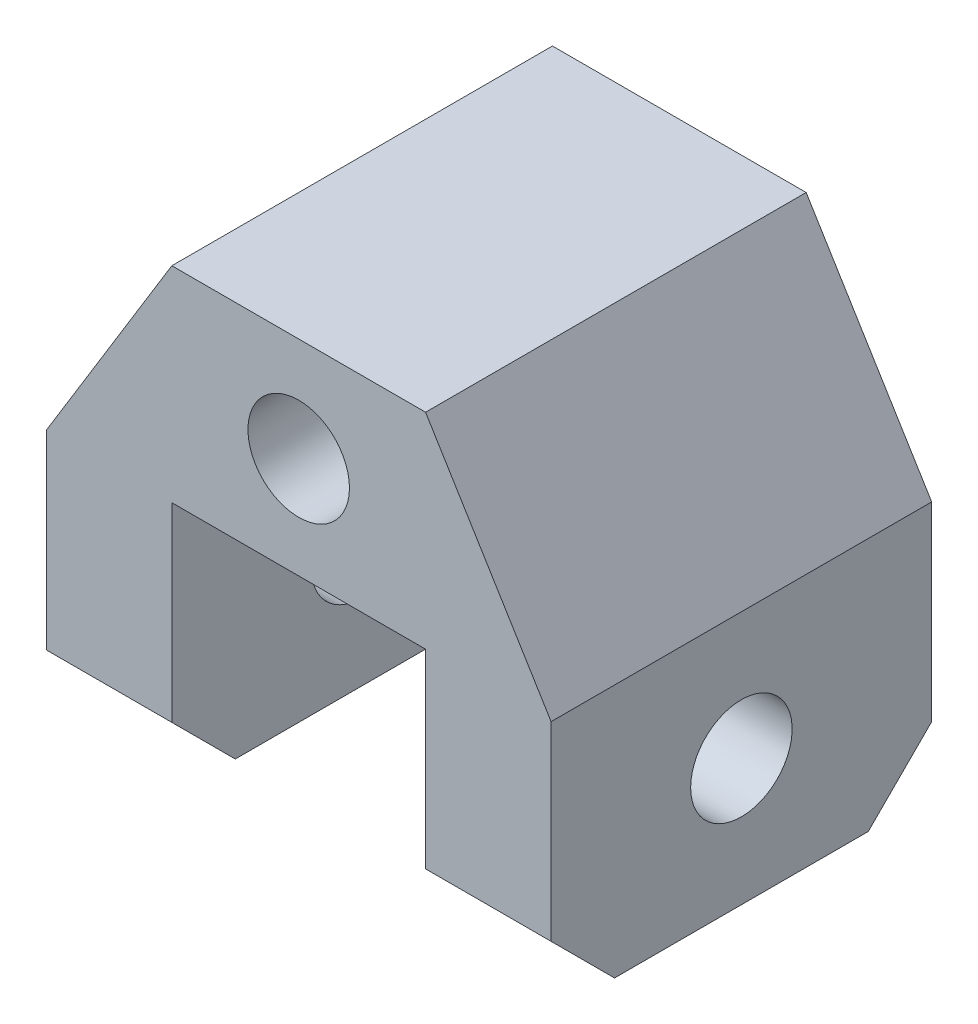
ISO-10303-21;
HEADER;
FILE_DESCRIPTION(('STEP AP214'),'2;1');
FILE_NAME('part.step','',(''),(''),'','','');
FILE_SCHEMA(('AUTOMOTIVE_DESIGN { 1 0 10303 214 1 1 1 1 }'));
ENDSEC;
DATA;
#1=APPLICATION_CONTEXT('core data for automotive mechanical design processes');
#2=APPLICATION_PROTOCOL_DEFINITION('international standard','automotive_design',2000,#1);
#3=PRODUCT_CONTEXT('',#1,'mechanical');
#4=PRODUCT('Part','Part','',(#3));
#5=PRODUCT_RELATED_PRODUCT_CATEGORY('part','',(#4));
#6=PRODUCT_DEFINITION_FORMATION('','',#4);
#7=PRODUCT_DEFINITION_CONTEXT('part definition',#1,'design');
#8=PRODUCT_DEFINITION('design','',#6,#7);
#9=PRODUCT_DEFINITION_SHAPE('','',#8);
#10=(LENGTH_UNIT() NAMED_UNIT(*) SI_UNIT(.MILLI.,.METRE.));
#11=(NAMED_UNIT(*) PLANE_ANGLE_UNIT() SI_UNIT($,.RADIAN.));
#12=(NAMED_UNIT(*) SI_UNIT($,.STERADIAN.) SOLID_ANGLE_UNIT());
#13=UNCERTAINTY_MEASURE_WITH_UNIT(LENGTH_MEASURE(1.E-05),#10,'distance_accuracy_value','');
#14=(GEOMETRIC_REPRESENTATION_CONTEXT(3) GLOBAL_UNCERTAINTY_ASSIGNED_CONTEXT((#13)) GLOBAL_UNIT_ASSIGNED_CONTEXT((#10,
#11,#12)) REPRESENTATION_CONTEXT('',''));
#15=CARTESIAN_POINT('',(0.,0.,0.));
#16=DIRECTION('',(0.,0.,1.));
#17=DIRECTION('',(1.,0.,0.));
#18=AXIS2_PLACEMENT_3D('',#15,#16,#17);
#19=CARTESIAN_POINT('',(35.,-28.2784738041002,30.));
#20=DIRECTION('',(0.,1.,0.));
#21=DIRECTION('',(0.,0.,1.));
#22=AXIS2_PLACEMENT_3D('',#19,#20,#21);
#23=PLANE('',#22);
#24=DIRECTION('',(0.,0.,-1.));
#25=VECTOR('',#24,1.);
#26=CARTESIAN_POINT('',(35.,-28.2784738041002,30.));
#27=LINE('',#26,#25);
#28=CARTESIAN_POINT('',(35.,-28.2784738041002,25.));
#29=VERTEX_POINT('',#28);
#30=CARTESIAN_POINT('',(35.,-28.2784738041002,5.));
#31=VERTEX_POINT('',#30);
#32=EDGE_CURVE('E173',#29,#31,#27,.T.);
#33=ORIENTED_EDGE('',*,*,#32,.T.);
#34=DIRECTION('',(1.,0.,0.));
#35=VECTOR('',#34,1.);
#36=CARTESIAN_POINT('',(44.8943898447674,-28.2784738041002,4.99999999999999));
#37=LINE('',#36,#35);
#38=CARTESIAN_POINT('',(44.8943898447674,-28.2784738041002,5.));
#39=VERTEX_POINT('',#38);
#40=EDGE_CURVE('E232',#31,#39,#37,.T.);
#41=ORIENTED_EDGE('',*,*,#40,.T.);
#42=DIRECTION('',(0.,0.,-1.));
#43=VECTOR('',#42,1.);
#44=CARTESIAN_POINT('',(44.8943898447674,-28.2784738041002,30.));
#45=LINE('',#44,#43);
#46=CARTESIAN_POINT('',(44.8943898447674,-28.2784738041002,25.));
#47=VERTEX_POINT('',#46);
#48=EDGE_CURVE('E151',#47,#39,#45,.T.);
#49=ORIENTED_EDGE('',*,*,#48,.F.);
#50=DIRECTION('',(-1.,0.,0.));
#51=VECTOR('',#50,1.);
#52=CARTESIAN_POINT('',(35.,-28.2784738041002,25.));
#53=LINE('',#52,#51);
#54=EDGE_CURVE('E230',#47,#29,#53,.T.);
#55=ORIENTED_EDGE('',*,*,#54,.T.);
#56=EDGE_LOOP('',(#33,#41,#49,#55));
#57=FACE_BOUND('',#56,.T.);
#58=ADVANCED_FACE('F31',(#57),#23,.F.);
#59=CARTESIAN_POINT('',(44.8943898447674,-8.27847380410023,30.));
#60=DIRECTION('',(-1.,0.,0.));
#61=DIRECTION('',(0.,0.,1.));
#62=AXIS2_PLACEMENT_3D('',#59,#60,#61);
#63=PLANE('',#62);
#64=CARTESIAN_POINT('',(44.8943898447674,-18.2784738041002,15.));
#65=DIRECTION('',(-1.,0.,0.));
#66=DIRECTION('',(0.,0.,1.));
#67=AXIS2_PLACEMENT_3D('',#64,#65,#66);
#68=CIRCLE('',#67,4.);
#69=CARTESIAN_POINT('',(44.8943898447674,-18.2784738041002,19.));
#70=VERTEX_POINT('',#69);
#71=EDGE_CURVE('E350',#70,#70,#68,.T.);
#72=ORIENTED_EDGE('',*,*,#71,.T.);
#73=EDGE_LOOP('',(#72));
#74=FACE_BOUND('',#73,.T.);
#75=ORIENTED_EDGE('',*,*,#48,.T.);
#76=DIRECTION('',(0.,0.707106781186549,-0.707106781186547));
#77=VECTOR('',#76,1.);
#78=CARTESIAN_POINT('',(44.8943898447674,-28.2784738041002,4.99999999999999));
#79=LINE('',#78,#77);
#80=CARTESIAN_POINT('',(44.8943898447674,-23.2784738041002,0.));
#81=VERTEX_POINT('',#80);
#82=EDGE_CURVE('E236',#39,#81,#79,.T.);
#83=ORIENTED_EDGE('',*,*,#82,.T.);
#84=DIRECTION('',(0.,1.,0.));
#85=VECTOR('',#84,1.);
#86=CARTESIAN_POINT('',(44.8943898447674,-8.27847380410023,0.));
#87=LINE('',#86,#85);
#88=CARTESIAN_POINT('',(44.8943898447674,-8.27847380410023,0.));
#89=VERTEX_POINT('',#88);
#90=EDGE_CURVE('E148',#81,#89,#87,.T.);
#91=ORIENTED_EDGE('',*,*,#90,.T.);
#92=DIRECTION('',(0.,0.,-1.));
#93=VECTOR('',#92,1.);
#94=CARTESIAN_POINT('',(44.8943898447674,-8.27847380410023,30.));
#95=LINE('',#94,#93);
#96=CARTESIAN_POINT('',(44.8943898447674,-8.27847380410023,30.));
#97=VERTEX_POINT('',#96);
#98=EDGE_CURVE('E144',#97,#89,#95,.T.);
#99=ORIENTED_EDGE('',*,*,#98,.F.);
#100=DIRECTION('',(0.,1.,0.));
#101=VECTOR('',#100,1.);
#102=CARTESIAN_POINT('',(44.8943898447674,-8.27847380410023,30.));
#103=LINE('',#102,#101);
#104=CARTESIAN_POINT('',(44.8943898447674,-23.2784738041002,30.));
#105=VERTEX_POINT('',#104);
#106=EDGE_CURVE('E134',#105,#97,#103,.T.);
#107=ORIENTED_EDGE('',*,*,#106,.F.);
#108=DIRECTION('',(0.,0.707106781186547,0.707106781186549));
#109=VECTOR('',#108,1.);
#110=CARTESIAN_POINT('',(44.8943898447674,-23.2784738041002,30.));
#111=LINE('',#110,#109);
#112=EDGE_CURVE('E55',#105,#47,#111,.F.);
#113=ORIENTED_EDGE('',*,*,#112,.T.);
#114=EDGE_LOOP('',(#75,#83,#91,#99,#107,#113));
#115=FACE_BOUND('',#114,.T.);
#116=ADVANCED_FACE('F146',(#74,#115),#63,.F.);
#117=CARTESIAN_POINT('',(35.,7.89639583302583,30.));
#118=DIRECTION('',(-0.853053020974568,-0.521824245705548,0.));
#119=DIRECTION('',(0.521824245705548,-0.853053020974568,0.));
#120=AXIS2_PLACEMENT_3D('',#117,#118,#119);
#121=PLANE('',#120);
#122=DIRECTION('',(-0.521824245705548,0.853053020974567,0.));
#123=VECTOR('',#122,1.);
#124=CARTESIAN_POINT('',(35.,7.89639583302583,0.));
#125=LINE('',#124,#123);
#126=CARTESIAN_POINT('',(35.,7.89639583302583,0.));
#127=VERTEX_POINT('',#126);
#128=EDGE_CURVE('E175',#89,#127,#125,.T.);
#129=ORIENTED_EDGE('',*,*,#128,.T.);
#130=DIRECTION('',(0.,0.,-1.));
#131=VECTOR('',#130,1.);
#132=CARTESIAN_POINT('',(35.,7.89639583302583,30.));
#133=LINE('',#132,#131);
#134=CARTESIAN_POINT('',(35.,7.89639583302583,30.));
#135=VERTEX_POINT('',#134);
#136=EDGE_CURVE('E152',#135,#127,#133,.T.);
#137=ORIENTED_EDGE('',*,*,#136,.F.);
#138=DIRECTION('',(-0.521824245705548,0.853053020974567,0.));
#139=VECTOR('',#138,1.);
#140=CARTESIAN_POINT('',(35.,7.89639583302583,30.));
#141=LINE('',#140,#139);
#142=EDGE_CURVE('E138',#97,#135,#141,.T.);
#143=ORIENTED_EDGE('',*,*,#142,.F.);
#144=ORIENTED_EDGE('',*,*,#98,.T.);
#145=EDGE_LOOP('',(#129,#137,#143,#144));
#146=FACE_BOUND('',#145,.T.);
#147=ADVANCED_FACE('F154',(#146),#121,.F.);
#148=CARTESIAN_POINT('',(15.,7.89639583302583,30.));
#149=DIRECTION('',(0.,-1.,0.));
#150=DIRECTION('',(0.,0.,-1.));
#151=AXIS2_PLACEMENT_3D('',#148,#149,#150);
#152=PLANE('',#151);
#153=DIRECTION('',(-1.,0.,0.));
#154=VECTOR('',#153,1.);
#155=CARTESIAN_POINT('',(15.,7.89639583302583,0.));
#156=LINE('',#155,#154);
#157=CARTESIAN_POINT('',(15.,7.89639583302583,0.));
#158=VERTEX_POINT('',#157);
#159=EDGE_CURVE('E178',#127,#158,#156,.T.);
#160=ORIENTED_EDGE('',*,*,#159,.T.);
#161=DIRECTION('',(0.,0.,-1.));
#162=VECTOR('',#161,1.);
#163=CARTESIAN_POINT('',(15.,7.89639583302583,30.));
#164=LINE('',#163,#162);
#165=CARTESIAN_POINT('',(15.,7.89639583302583,30.));
#166=VERTEX_POINT('',#165);
#167=EDGE_CURVE('E208',#166,#158,#164,.T.);
#168=ORIENTED_EDGE('',*,*,#167,.F.);
#169=DIRECTION('',(-1.,0.,0.));
#170=VECTOR('',#169,1.);
#171=CARTESIAN_POINT('',(15.,7.89639583302583,30.));
#172=LINE('',#171,#170);
#173=EDGE_CURVE('E157',#135,#166,#172,.T.);
#174=ORIENTED_EDGE('',*,*,#173,.F.);
#175=ORIENTED_EDGE('',*,*,#136,.T.);
#176=EDGE_LOOP('',(#160,#168,#174,#175));
#177=FACE_BOUND('',#176,.T.);
#178=ADVANCED_FACE('F272',(#177),#152,.F.);
#179=CARTESIAN_POINT('',(15.,7.89639583302583,30.));
#180=DIRECTION('',(0.853053020974567,-0.521824245705548,0.));
#181=DIRECTION('',(0.521824245705548,0.853053020974567,0.));
#182=AXIS2_PLACEMENT_3D('',#179,#180,#181);
#183=PLANE('',#182);
#184=DIRECTION('',(-0.521824245705548,-0.853053020974567,0.));
#185=VECTOR('',#184,1.);
#186=CARTESIAN_POINT('',(15.,7.89639583302583,0.));
#187=LINE('',#186,#185);
#188=CARTESIAN_POINT('',(5.10561015523264,-8.27847380410023,0.));
#189=VERTEX_POINT('',#188);
#190=EDGE_CURVE('E180',#158,#189,#187,.T.);
#191=ORIENTED_EDGE('',*,*,#190,.T.);
#192=DIRECTION('',(0.,0.,-1.));
#193=VECTOR('',#192,1.);
#194=CARTESIAN_POINT('',(5.10561015523264,-8.27847380410023,30.));
#195=LINE('',#194,#193);
#196=CARTESIAN_POINT('',(5.10561015523264,-8.27847380410023,30.));
#197=VERTEX_POINT('',#196);
#198=EDGE_CURVE('E205',#197,#189,#195,.T.);
#199=ORIENTED_EDGE('',*,*,#198,.F.);
#200=DIRECTION('',(-0.521824245705548,-0.853053020974567,0.));
#201=VECTOR('',#200,1.);
#202=CARTESIAN_POINT('',(15.,7.89639583302583,30.));
#203=LINE('',#202,#201);
#204=EDGE_CURVE('E159',#166,#197,#203,.T.);
#205=ORIENTED_EDGE('',*,*,#204,.F.);
#206=ORIENTED_EDGE('',*,*,#167,.T.);
#207=EDGE_LOOP('',(#191,#199,#205,#206));
#208=FACE_BOUND('',#207,.T.);
#209=ADVANCED_FACE('F277',(#208),#183,.F.);
#210=CARTESIAN_POINT('',(5.10561015523264,-8.27847380410023,30.));
#211=DIRECTION('',(1.,0.,0.));
#212=DIRECTION('',(0.,1.,0.));
#213=AXIS2_PLACEMENT_3D('',#210,#211,#212);
#214=PLANE('',#213);
#215=CARTESIAN_POINT('',(5.10561015523264,-18.2784738041002,15.));
#216=DIRECTION('',(-1.,0.,0.));
#217=DIRECTION('',(0.,0.,1.));
#218=AXIS2_PLACEMENT_3D('',#215,#216,#217);
#219=CIRCLE('',#218,4.);
#220=CARTESIAN_POINT('',(5.10561015523264,-18.2784738041002,19.));
#221=VERTEX_POINT('',#220);
#222=EDGE_CURVE('E347',#221,#221,#219,.T.);
#223=ORIENTED_EDGE('',*,*,#222,.F.);
#224=EDGE_LOOP('',(#223));
#225=FACE_BOUND('',#224,.T.);
#226=DIRECTION('',(0.,-1.,0.));
#227=VECTOR('',#226,1.);
#228=CARTESIAN_POINT('',(5.10561015523264,-8.27847380410023,0.));
#229=LINE('',#228,#227);
#230=CARTESIAN_POINT('',(5.10561015523264,-23.2784738041002,0.));
#231=VERTEX_POINT('',#230);
#232=EDGE_CURVE('E182',#189,#231,#229,.T.);
#233=ORIENTED_EDGE('',*,*,#232,.T.);
#234=DIRECTION('',(0.,-0.707106781186549,0.707106781186547));
#235=VECTOR('',#234,1.);
#236=CARTESIAN_POINT('',(5.10561015523264,-28.2784738041002,4.99999999999999));
#237=LINE('',#236,#235);
#238=CARTESIAN_POINT('',(5.10561015523264,-28.2784738041002,5.));
#239=VERTEX_POINT('',#238);
#240=EDGE_CURVE('E228',#231,#239,#237,.T.);
#241=ORIENTED_EDGE('',*,*,#240,.T.);
#242=DIRECTION('',(0.,0.,-1.));
#243=VECTOR('',#242,1.);
#244=CARTESIAN_POINT('',(5.10561015523264,-28.2784738041002,30.));
#245=LINE('',#244,#243);
#246=CARTESIAN_POINT('',(5.10561015523264,-28.2784738041002,25.));
#247=VERTEX_POINT('',#246);
#248=EDGE_CURVE('E202',#247,#239,#245,.T.);
#249=ORIENTED_EDGE('',*,*,#248,.F.);
#250=DIRECTION('',(0.,-0.707106781186547,-0.707106781186549));
#251=VECTOR('',#250,1.);
#252=CARTESIAN_POINT('',(5.10561015523264,-23.2784738041002,30.));
#253=LINE('',#252,#251);
#254=CARTESIAN_POINT('',(5.10561015523264,-23.2784738041002,30.));
#255=VERTEX_POINT('',#254);
#256=EDGE_CURVE('E226',#247,#255,#253,.F.);
#257=ORIENTED_EDGE('',*,*,#256,.T.);
#258=DIRECTION('',(0.,-1.,0.));
#259=VECTOR('',#258,1.);
#260=CARTESIAN_POINT('',(5.10561015523264,-8.27847380410023,30.));
#261=LINE('',#260,#259);
#262=EDGE_CURVE('E164',#197,#255,#261,.T.);
#263=ORIENTED_EDGE('',*,*,#262,.F.);
#264=ORIENTED_EDGE('',*,*,#198,.T.);
#265=EDGE_LOOP('',(#233,#241,#249,#257,#263,#264));
#266=FACE_BOUND('',#265,.T.);
#267=ADVANCED_FACE('F280',(#225,#266),#214,.F.);
#268=CARTESIAN_POINT('',(5.10561015523264,-28.2784738041002,30.));
#269=DIRECTION('',(0.,1.,0.));
#270=DIRECTION('',(0.,0.,1.));
#271=AXIS2_PLACEMENT_3D('',#268,#269,#270);
#272=PLANE('',#271);
#273=ORIENTED_EDGE('',*,*,#248,.T.);
#274=DIRECTION('',(1.,0.,0.));
#275=VECTOR('',#274,1.);
#276=CARTESIAN_POINT('',(15.,-28.2784738041002,4.99999999999999));
#277=LINE('',#276,#275);
#278=CARTESIAN_POINT('',(15.,-28.2784738041002,5.));
#279=VERTEX_POINT('',#278);
#280=EDGE_CURVE('E215',#239,#279,#277,.T.);
#281=ORIENTED_EDGE('',*,*,#280,.T.);
#282=DIRECTION('',(0.,0.,-1.));
#283=VECTOR('',#282,1.);
#284=CARTESIAN_POINT('',(15.,-28.2784738041002,30.));
#285=LINE('',#284,#283);
#286=CARTESIAN_POINT('',(15.,-28.2784738041002,25.));
#287=VERTEX_POINT('',#286);
#288=EDGE_CURVE('E199',#287,#279,#285,.T.);
#289=ORIENTED_EDGE('',*,*,#288,.F.);
#290=DIRECTION('',(-1.,0.,0.));
#291=VECTOR('',#290,1.);
#292=CARTESIAN_POINT('',(5.10561015523264,-28.2784738041002,25.));
#293=LINE('',#292,#291);
#294=EDGE_CURVE('E213',#287,#247,#293,.T.);
#295=ORIENTED_EDGE('',*,*,#294,.T.);
#296=EDGE_LOOP('',(#273,#281,#289,#295));
#297=FACE_BOUND('',#296,.T.);
#298=ADVANCED_FACE('F284',(#297),#272,.F.);
#299=CARTESIAN_POINT('',(15.,-28.2784738041002,30.));
#300=DIRECTION('',(-1.,0.,0.));
#301=DIRECTION('',(0.,0.,1.));
#302=AXIS2_PLACEMENT_3D('',#299,#300,#301);
#303=PLANE('',#302);
#304=CARTESIAN_POINT('',(15.,-18.2784738041002,15.));
#305=DIRECTION('',(-1.,0.,0.));
#306=DIRECTION('',(0.,0.,1.));
#307=AXIS2_PLACEMENT_3D('',#304,#305,#306);
#308=CIRCLE('',#307,4.);
#309=CARTESIAN_POINT('',(15.,-18.2784738041002,19.));
#310=VERTEX_POINT('',#309);
#311=EDGE_CURVE('E176',#310,#310,#308,.T.);
#312=ORIENTED_EDGE('',*,*,#311,.T.);
#313=EDGE_LOOP('',(#312));
#314=FACE_BOUND('',#313,.T.);
#315=ORIENTED_EDGE('',*,*,#288,.T.);
#316=DIRECTION('',(0.,0.707106781186549,-0.707106781186547));
#317=VECTOR('',#316,1.);
#318=CARTESIAN_POINT('',(15.,-28.2784738041002,4.99999999999999));
#319=LINE('',#318,#317);
#320=CARTESIAN_POINT('',(15.,-23.2784738041002,0.));
#321=VERTEX_POINT('',#320);
#322=EDGE_CURVE('E220',#279,#321,#319,.T.);
#323=ORIENTED_EDGE('',*,*,#322,.T.);
#324=DIRECTION('',(0.,1.,0.));
#325=VECTOR('',#324,1.);
#326=CARTESIAN_POINT('',(15.,-28.2784738041002,0.));
#327=LINE('',#326,#325);
#328=CARTESIAN_POINT('',(15.,-8.27847380410023,0.));
#329=VERTEX_POINT('',#328);
#330=EDGE_CURVE('E185',#321,#329,#327,.T.);
#331=ORIENTED_EDGE('',*,*,#330,.T.);
#332=DIRECTION('',(0.,0.,-1.));
#333=VECTOR('',#332,1.);
#334=CARTESIAN_POINT('',(15.,-8.27847380410023,30.));
#335=LINE('',#334,#333);
#336=CARTESIAN_POINT('',(15.,-8.27847380410023,30.));
#337=VERTEX_POINT('',#336);
#338=EDGE_CURVE('E196',#337,#329,#335,.T.);
#339=ORIENTED_EDGE('',*,*,#338,.F.);
#340=DIRECTION('',(0.,1.,0.));
#341=VECTOR('',#340,1.);
#342=CARTESIAN_POINT('',(15.,-28.2784738041002,30.));
#343=LINE('',#342,#341);
#344=CARTESIAN_POINT('',(15.,-23.2784738041002,30.));
#345=VERTEX_POINT('',#344);
#346=EDGE_CURVE('E167',#345,#337,#343,.T.);
#347=ORIENTED_EDGE('',*,*,#346,.F.);
#348=DIRECTION('',(0.,0.707106781186547,0.707106781186549));
#349=VECTOR('',#348,1.);
#350=CARTESIAN_POINT('',(15.,-23.2784738041002,30.));
#351=LINE('',#350,#349);
#352=EDGE_CURVE('E218',#345,#287,#351,.F.);
#353=ORIENTED_EDGE('',*,*,#352,.T.);
#354=EDGE_LOOP('',(#315,#323,#331,#339,#347,#353));
#355=FACE_BOUND('',#354,.T.);
#356=ADVANCED_FACE('F249',(#314,#355),#303,.F.);
#357=CARTESIAN_POINT('',(15.,-8.27847380410023,30.));
#358=DIRECTION('',(0.,1.,0.));
#359=DIRECTION('',(0.,0.,1.));
#360=AXIS2_PLACEMENT_3D('',#357,#358,#359);
#361=PLANE('',#360);
#362=DIRECTION('',(1.,0.,0.));
#363=VECTOR('',#362,1.);
#364=CARTESIAN_POINT('',(15.,-8.27847380410023,0.));
#365=LINE('',#364,#363);
#366=CARTESIAN_POINT('',(35.,-8.27847380410023,0.));
#367=VERTEX_POINT('',#366);
#368=EDGE_CURVE('E187',#329,#367,#365,.T.);
#369=ORIENTED_EDGE('',*,*,#368,.T.);
#370=DIRECTION('',(0.,0.,-1.));
#371=VECTOR('',#370,1.);
#372=CARTESIAN_POINT('',(35.,-8.27847380410023,30.));
#373=LINE('',#372,#371);
#374=CARTESIAN_POINT('',(35.,-8.27847380410023,30.));
#375=VERTEX_POINT('',#374);
#376=EDGE_CURVE('E193',#375,#367,#373,.T.);
#377=ORIENTED_EDGE('',*,*,#376,.F.);
#378=DIRECTION('',(1.,0.,0.));
#379=VECTOR('',#378,1.);
#380=CARTESIAN_POINT('',(15.,-8.27847380410023,30.));
#381=LINE('',#380,#379);
#382=EDGE_CURVE('E169',#337,#375,#381,.T.);
#383=ORIENTED_EDGE('',*,*,#382,.F.);
#384=ORIENTED_EDGE('',*,*,#338,.T.);
#385=EDGE_LOOP('',(#369,#377,#383,#384));
#386=FACE_BOUND('',#385,.T.);
#387=ADVANCED_FACE('F256',(#386),#361,.F.);
#388=CARTESIAN_POINT('',(35.,-28.2784738041002,30.));
#389=DIRECTION('',(1.,0.,0.));
#390=DIRECTION('',(0.,0.,-1.));
#391=AXIS2_PLACEMENT_3D('',#388,#389,#390);
#392=PLANE('',#391);
#393=CARTESIAN_POINT('',(35.,-18.2784738041002,15.));
#394=DIRECTION('',(1.,0.,0.));
#395=DIRECTION('',(0.,0.,-1.));
#396=AXIS2_PLACEMENT_3D('',#393,#394,#395);
#397=CIRCLE('',#396,4.);
#398=CARTESIAN_POINT('',(35.,-18.2784738041002,11.));
#399=VERTEX_POINT('',#398);
#400=EDGE_CURVE('E35',#399,#399,#397,.T.);
#401=ORIENTED_EDGE('',*,*,#400,.T.);
#402=EDGE_LOOP('',(#401));
#403=FACE_BOUND('',#402,.T.);
#404=DIRECTION('',(0.,-1.,0.));
#405=VECTOR('',#404,1.);
#406=CARTESIAN_POINT('',(35.,-28.2784738041002,0.));
#407=LINE('',#406,#405);
#408=CARTESIAN_POINT('',(35.,-23.2784738041002,0.));
#409=VERTEX_POINT('',#408);
#410=EDGE_CURVE('E141',#367,#409,#407,.T.);
#411=ORIENTED_EDGE('',*,*,#410,.T.);
#412=DIRECTION('',(0.,-0.707106781186549,0.707106781186547));
#413=VECTOR('',#412,1.);
#414=CARTESIAN_POINT('',(35.,-28.2784738041002,4.99999999999999));
#415=LINE('',#414,#413);
#416=EDGE_CURVE('E239',#409,#31,#415,.T.);
#417=ORIENTED_EDGE('',*,*,#416,.T.);
#418=ORIENTED_EDGE('',*,*,#32,.F.);
#419=DIRECTION('',(0.,-0.707106781186547,-0.707106781186549));
#420=VECTOR('',#419,1.);
#421=CARTESIAN_POINT('',(35.,-23.2784738041002,30.));
#422=LINE('',#421,#420);
#423=CARTESIAN_POINT('',(35.,-23.2784738041002,30.));
#424=VERTEX_POINT('',#423);
#425=EDGE_CURVE('E47',#29,#424,#422,.F.);
#426=ORIENTED_EDGE('',*,*,#425,.T.);
#427=DIRECTION('',(0.,-1.,0.));
#428=VECTOR('',#427,1.);
#429=CARTESIAN_POINT('',(35.,-28.2784738041002,30.));
#430=LINE('',#429,#428);
#431=EDGE_CURVE('E171',#375,#424,#430,.T.);
#432=ORIENTED_EDGE('',*,*,#431,.F.);
#433=ORIENTED_EDGE('',*,*,#376,.T.);
#434=EDGE_LOOP('',(#411,#417,#418,#426,#432,#433));
#435=FACE_BOUND('',#434,.T.);
#436=ADVANCED_FACE('F261',(#403,#435),#392,.F.);
#437=CARTESIAN_POINT('',(44.8943898447674,-28.2784738041002,30.));
#438=DIRECTION('',(0.,0.,-1.));
#439=DIRECTION('',(-1.,0.,0.));
#440=AXIS2_PLACEMENT_3D('',#437,#438,#439);
#441=PLANE('',#440);
#442=CARTESIAN_POINT('',(25.,-0.278473804100229,30.));
#443=DIRECTION('',(0.,0.,1.));
#444=DIRECTION('',(1.,0.,0.));
#445=AXIS2_PLACEMENT_3D('',#442,#443,#444);
#446=CIRCLE('',#445,4.);
#447=CARTESIAN_POINT('',(29.,-0.278473804100229,30.));
#448=VERTEX_POINT('',#447);
#449=EDGE_CURVE('E345',#448,#448,#446,.T.);
#450=ORIENTED_EDGE('',*,*,#449,.F.);
#451=EDGE_LOOP('',(#450));
#452=FACE_BOUND('',#451,.T.);
#453=ORIENTED_EDGE('',*,*,#431,.T.);
#454=DIRECTION('',(1.,0.,0.));
#455=VECTOR('',#454,1.);
#456=CARTESIAN_POINT('',(44.8943898447674,-23.2784738041002,30.));
#457=LINE('',#456,#455);
#458=EDGE_CURVE('E11',#424,#105,#457,.T.);
#459=ORIENTED_EDGE('',*,*,#458,.T.);
#460=ORIENTED_EDGE('',*,*,#106,.T.);
#461=ORIENTED_EDGE('',*,*,#142,.T.);
#462=ORIENTED_EDGE('',*,*,#173,.T.);
#463=ORIENTED_EDGE('',*,*,#204,.T.);
#464=ORIENTED_EDGE('',*,*,#262,.T.);
#465=DIRECTION('',(1.,0.,0.));
#466=VECTOR('',#465,1.);
#467=CARTESIAN_POINT('',(44.8943898447674,-23.2784738041002,30.));
#468=LINE('',#467,#466);
#469=EDGE_CURVE('E40',#255,#345,#468,.T.);
#470=ORIENTED_EDGE('',*,*,#469,.T.);
#471=ORIENTED_EDGE('',*,*,#346,.T.);
#472=ORIENTED_EDGE('',*,*,#382,.T.);
#473=EDGE_LOOP('',(#453,#459,#460,#461,#462,#463,#464,#470,#471,#472));
#474=FACE_BOUND('',#473,.T.);
#475=ADVANCED_FACE('F136',(#452,#474),#441,.F.);
#476=CARTESIAN_POINT('',(44.8943898447674,-28.2784738041002,0.));
#477=DIRECTION('',(0.,0.,-1.));
#478=DIRECTION('',(-1.,0.,0.));
#479=AXIS2_PLACEMENT_3D('',#476,#477,#478);
#480=PLANE('',#479);
#481=CARTESIAN_POINT('',(25.,-0.278473804100229,0.));
#482=DIRECTION('',(0.,0.,1.));
#483=DIRECTION('',(1.,0.,0.));
#484=AXIS2_PLACEMENT_3D('',#481,#482,#483);
#485=CIRCLE('',#484,4.);
#486=CARTESIAN_POINT('',(29.,-0.278473804100229,0.));
#487=VERTEX_POINT('',#486);
#488=EDGE_CURVE('E342',#487,#487,#485,.T.);
#489=ORIENTED_EDGE('',*,*,#488,.T.);
#490=EDGE_LOOP('',(#489));
#491=FACE_BOUND('',#490,.T.);
#492=ORIENTED_EDGE('',*,*,#330,.F.);
#493=DIRECTION('',(-1.,0.,0.));
#494=VECTOR('',#493,1.);
#495=CARTESIAN_POINT('',(5.10561015523264,-23.2784738041002,0.));
#496=LINE('',#495,#494);
#497=EDGE_CURVE('E224',#321,#231,#496,.T.);
#498=ORIENTED_EDGE('',*,*,#497,.T.);
#499=ORIENTED_EDGE('',*,*,#232,.F.);
#500=ORIENTED_EDGE('',*,*,#190,.F.);
#501=ORIENTED_EDGE('',*,*,#159,.F.);
#502=ORIENTED_EDGE('',*,*,#128,.F.);
#503=ORIENTED_EDGE('',*,*,#90,.F.);
#504=DIRECTION('',(-1.,0.,0.));
#505=VECTOR('',#504,1.);
#506=CARTESIAN_POINT('',(35.,-23.2784738041002,0.));
#507=LINE('',#506,#505);
#508=EDGE_CURVE('E222',#81,#409,#507,.T.);
#509=ORIENTED_EDGE('',*,*,#508,.T.);
#510=ORIENTED_EDGE('',*,*,#410,.F.);
#511=ORIENTED_EDGE('',*,*,#368,.F.);
#512=EDGE_LOOP('',(#492,#498,#499,#500,#501,#502,#503,#509,#510,#511));
#513=FACE_BOUND('',#512,.T.);
#514=ADVANCED_FACE('F268',(#491,#513),#480,.T.);
#515=CARTESIAN_POINT('',(5.10561015523264,-28.2784738041002,4.99999999999999));
#516=DIRECTION('',(0.,-0.707106781186546,-0.707106781186548));
#517=DIRECTION('',(0.,0.707106781186549,-0.707106781186547));
#518=AXIS2_PLACEMENT_3D('',#515,#516,#517);
#519=PLANE('',#518);
#520=ORIENTED_EDGE('',*,*,#240,.F.);
#521=ORIENTED_EDGE('',*,*,#497,.F.);
#522=ORIENTED_EDGE('',*,*,#322,.F.);
#523=ORIENTED_EDGE('',*,*,#280,.F.);
#524=EDGE_LOOP('',(#520,#521,#522,#523));
#525=FACE_BOUND('',#524,.T.);
#526=ADVANCED_FACE('F289',(#525),#519,.T.);
#527=CARTESIAN_POINT('',(35.,-28.2784738041002,4.99999999999999));
#528=DIRECTION('',(0.,-0.707106781186546,-0.707106781186548));
#529=DIRECTION('',(0.,0.707106781186549,-0.707106781186547));
#530=AXIS2_PLACEMENT_3D('',#527,#528,#529);
#531=PLANE('',#530);
#532=ORIENTED_EDGE('',*,*,#416,.F.);
#533=ORIENTED_EDGE('',*,*,#508,.F.);
#534=ORIENTED_EDGE('',*,*,#82,.F.);
#535=ORIENTED_EDGE('',*,*,#40,.F.);
#536=EDGE_LOOP('',(#532,#533,#534,#535));
#537=FACE_BOUND('',#536,.T.);
#538=ADVANCED_FACE('F266',(#537),#531,.T.);
#539=CARTESIAN_POINT('',(44.8943898447674,-23.2784738041002,30.));
#540=DIRECTION('',(0.,0.707106781186548,-0.707106781186546));
#541=DIRECTION('',(0.,0.707106781186547,0.707106781186549));
#542=AXIS2_PLACEMENT_3D('',#539,#540,#541);
#543=PLANE('',#542);
#544=ORIENTED_EDGE('',*,*,#425,.F.);
#545=ORIENTED_EDGE('',*,*,#54,.F.);
#546=ORIENTED_EDGE('',*,*,#112,.F.);
#547=ORIENTED_EDGE('',*,*,#458,.F.);
#548=EDGE_LOOP('',(#544,#545,#546,#547));
#549=FACE_BOUND('',#548,.T.);
#550=ADVANCED_FACE('F257',(#549),#543,.F.);
#551=CARTESIAN_POINT('',(44.8943898447674,-23.2784738041002,30.));
#552=DIRECTION('',(0.,0.707106781186548,-0.707106781186546));
#553=DIRECTION('',(0.,0.707106781186547,0.707106781186549));
#554=AXIS2_PLACEMENT_3D('',#551,#552,#553);
#555=PLANE('',#554);
#556=ORIENTED_EDGE('',*,*,#256,.F.);
#557=ORIENTED_EDGE('',*,*,#294,.F.);
#558=ORIENTED_EDGE('',*,*,#352,.F.);
#559=ORIENTED_EDGE('',*,*,#469,.F.);
#560=EDGE_LOOP('',(#556,#557,#558,#559));
#561=FACE_BOUND('',#560,.T.);
#562=ADVANCED_FACE('F33',(#561),#555,.F.);
#563=CARTESIAN_POINT('',(44.8943898447674,-18.2784738041002,15.));
#564=DIRECTION('',(-1.,0.,0.));
#565=DIRECTION('',(0.,0.,1.));
#566=AXIS2_PLACEMENT_3D('',#563,#564,#565);
#567=CYLINDRICAL_SURFACE('',#566,4.);
#568=ORIENTED_EDGE('',*,*,#71,.F.);
#569=EDGE_LOOP('',(#568));
#570=FACE_BOUND('',#569,.T.);
#571=ORIENTED_EDGE('',*,*,#400,.F.);
#572=EDGE_LOOP('',(#571));
#573=FACE_BOUND('',#572,.T.);
#574=ADVANCED_FACE('F333',(#570,#573),#567,.F.);
#575=ORIENTED_EDGE('',*,*,#222,.T.);
#576=EDGE_LOOP('',(#575));
#577=FACE_BOUND('',#576,.T.);
#578=ORIENTED_EDGE('',*,*,#311,.F.);
#579=EDGE_LOOP('',(#578));
#580=FACE_BOUND('',#579,.T.);
#581=ADVANCED_FACE('F329',(#577,#580),#567,.F.);
#582=CARTESIAN_POINT('',(25.,-0.278473804100229,0.));
#583=DIRECTION('',(0.,0.,1.));
#584=DIRECTION('',(1.,0.,0.));
#585=AXIS2_PLACEMENT_3D('',#582,#583,#584);
#586=CYLINDRICAL_SURFACE('',#585,4.);
#587=CARTESIAN_POINT('',(29.,-0.278473804100229,0.));
#588=CARTESIAN_POINT('',(29.,-0.278473804100229,0.312499999999997));
#589=CARTESIAN_POINT('',(29.,-0.278473804100229,0.624999999999997));
#590=CARTESIAN_POINT('',(29.,-0.278473804100229,1.25));
#591=CARTESIAN_POINT('',(29.,-0.278473804100229,1.5625));
#592=CARTESIAN_POINT('',(29.,-0.278473804100229,2.1875));
#593=CARTESIAN_POINT('',(29.,-0.278473804100229,2.5));
#594=CARTESIAN_POINT('',(29.,-0.278473804100229,3.125));
#595=CARTESIAN_POINT('',(29.,-0.278473804100229,3.4375));
#596=CARTESIAN_POINT('',(29.,-0.278473804100229,4.0625));
#597=CARTESIAN_POINT('',(29.,-0.278473804100229,4.375));
#598=CARTESIAN_POINT('',(29.,-0.278473804100229,5.));
#599=CARTESIAN_POINT('',(29.,-0.278473804100229,5.3125));
#600=CARTESIAN_POINT('',(29.,-0.278473804100229,5.9375));
#601=CARTESIAN_POINT('',(29.,-0.278473804100229,6.25));
#602=CARTESIAN_POINT('',(29.,-0.278473804100229,6.875));
#603=CARTESIAN_POINT('',(29.,-0.278473804100229,7.1875));
#604=CARTESIAN_POINT('',(29.,-0.278473804100229,7.8125));
#605=CARTESIAN_POINT('',(29.,-0.278473804100229,8.125));
#606=CARTESIAN_POINT('',(29.,-0.278473804100229,8.75));
#607=CARTESIAN_POINT('',(29.,-0.278473804100229,9.0625));
#608=CARTESIAN_POINT('',(29.,-0.278473804100229,9.6875));
#609=CARTESIAN_POINT('',(29.,-0.278473804100229,10.));
#610=CARTESIAN_POINT('',(29.,-0.278473804100229,10.625));
#611=CARTESIAN_POINT('',(29.,-0.278473804100229,10.9375));
#612=CARTESIAN_POINT('',(29.,-0.278473804100229,11.5625));
#613=CARTESIAN_POINT('',(29.,-0.278473804100229,11.875));
#614=CARTESIAN_POINT('',(29.,-0.278473804100229,12.5));
#615=CARTESIAN_POINT('',(29.,-0.278473804100229,12.8125));
#616=CARTESIAN_POINT('',(29.,-0.278473804100229,13.4375));
#617=CARTESIAN_POINT('',(29.,-0.278473804100229,13.75));
#618=CARTESIAN_POINT('',(29.,-0.278473804100229,14.375));
#619=CARTESIAN_POINT('',(29.,-0.278473804100229,14.6875));
#620=CARTESIAN_POINT('',(29.,-0.278473804100229,15.3125));
#621=CARTESIAN_POINT('',(29.,-0.278473804100229,15.625));
#622=CARTESIAN_POINT('',(29.,-0.278473804100229,16.25));
#623=CARTESIAN_POINT('',(29.,-0.278473804100229,16.5625));
#624=CARTESIAN_POINT('',(29.,-0.278473804100229,17.1875));
#625=CARTESIAN_POINT('',(29.,-0.278473804100229,17.5));
#626=CARTESIAN_POINT('',(29.,-0.278473804100229,18.125));
#627=CARTESIAN_POINT('',(29.,-0.278473804100229,18.4375));
#628=CARTESIAN_POINT('',(29.,-0.278473804100229,19.0625));
#629=CARTESIAN_POINT('',(29.,-0.278473804100229,19.375));
#630=CARTESIAN_POINT('',(29.,-0.278473804100229,20.));
#631=CARTESIAN_POINT('',(29.,-0.278473804100229,20.3125));
#632=CARTESIAN_POINT('',(29.,-0.278473804100229,20.9375));
#633=CARTESIAN_POINT('',(29.,-0.278473804100229,21.25));
#634=CARTESIAN_POINT('',(29.,-0.278473804100229,21.875));
#635=CARTESIAN_POINT('',(29.,-0.278473804100229,22.1875));
#636=CARTESIAN_POINT('',(29.,-0.278473804100229,22.8125));
#637=CARTESIAN_POINT('',(29.,-0.278473804100229,23.125));
#638=CARTESIAN_POINT('',(29.,-0.278473804100229,23.75));
#639=CARTESIAN_POINT('',(29.,-0.278473804100229,24.0625));
#640=CARTESIAN_POINT('',(29.,-0.278473804100229,24.6875));
#641=CARTESIAN_POINT('',(29.,-0.278473804100229,25.));
#642=CARTESIAN_POINT('',(29.,-0.278473804100229,25.625));
#643=CARTESIAN_POINT('',(29.,-0.278473804100229,25.9375));
#644=CARTESIAN_POINT('',(29.,-0.278473804100229,26.5625));
#645=CARTESIAN_POINT('',(29.,-0.278473804100229,26.875));
#646=CARTESIAN_POINT('',(29.,-0.278473804100229,27.5));
#647=CARTESIAN_POINT('',(29.,-0.278473804100229,27.8125));
#648=CARTESIAN_POINT('',(29.,-0.278473804100229,28.4375));
#649=CARTESIAN_POINT('',(29.,-0.278473804100229,28.75));
#650=CARTESIAN_POINT('',(29.,-0.278473804100229,29.375));
#651=CARTESIAN_POINT('',(29.,-0.278473804100229,29.6875));
#652=CARTESIAN_POINT('',(29.,-0.278473804100229,30.));
#653=B_SPLINE_CURVE_WITH_KNOTS('',3,(#587,#588,#589,#590,#591,#592,#593,#594,#595,#596,#597,
#598,#599,#600,#601,#602,#603,#604,#605,#606,#607,#608,#609,#610,#611,#612,#613,#614,#615,#616,
#617,#618,#619,#620,#621,#622,#623,#624,#625,#626,#627,#628,#629,#630,#631,#632,#633,#634,#635,
#636,#637,#638,#639,#640,#641,#642,#643,#644,#645,#646,#647,#648,#649,#650,#651,#652),
.UNSPECIFIED.,.F.,.F.,(4,2,2,2,2,2,2,2,2,2,2,2,2,2,2,2,2,2,2,2,2,2,2,2,2,2,2,2,2,2,2,2,4),(0.,
0.9375,1.875,2.8125,3.75,4.6875,5.625,6.5625,7.5,8.4375,9.375,10.3125,11.25,12.1875,13.125,
14.0625,15.,15.9375,16.875,17.8125,18.75,19.6875,20.625,21.5625,22.5,23.4375,24.375,25.3125,
26.25,27.1875,28.125,29.0625,30.),.UNSPECIFIED.);
#654=EDGE_CURVE('BSEAM332',#487,#448,#653,.T.);
#655=ORIENTED_EDGE('',*,*,#488,.F.);
#656=ORIENTED_EDGE('',*,*,#449,.T.);
#657=ORIENTED_EDGE('',*,*,#654,.T.);
#658=ORIENTED_EDGE('',*,*,#654,.F.);
#659=EDGE_LOOP('',(#655,#657,#656,#658));
#660=FACE_BOUND('',#659,.T.);
#661=ADVANCED_FACE('F332',(#660),#586,.F.);
#662=CLOSED_SHELL('',(#58,#116,#147,#178,#209,#267,#298,#356,#387,#436,#475,#514,#526,#538,#550,
#562,#574,#581,#661));
#663=MANIFOLD_SOLID_BREP('B2',#662);
#664=ADVANCED_BREP_SHAPE_REPRESENTATION('',(#18,#663),#14);
#665=SHAPE_DEFINITION_REPRESENTATION(#9,#664);
ENDSEC;
END-ISO-10303-21;
